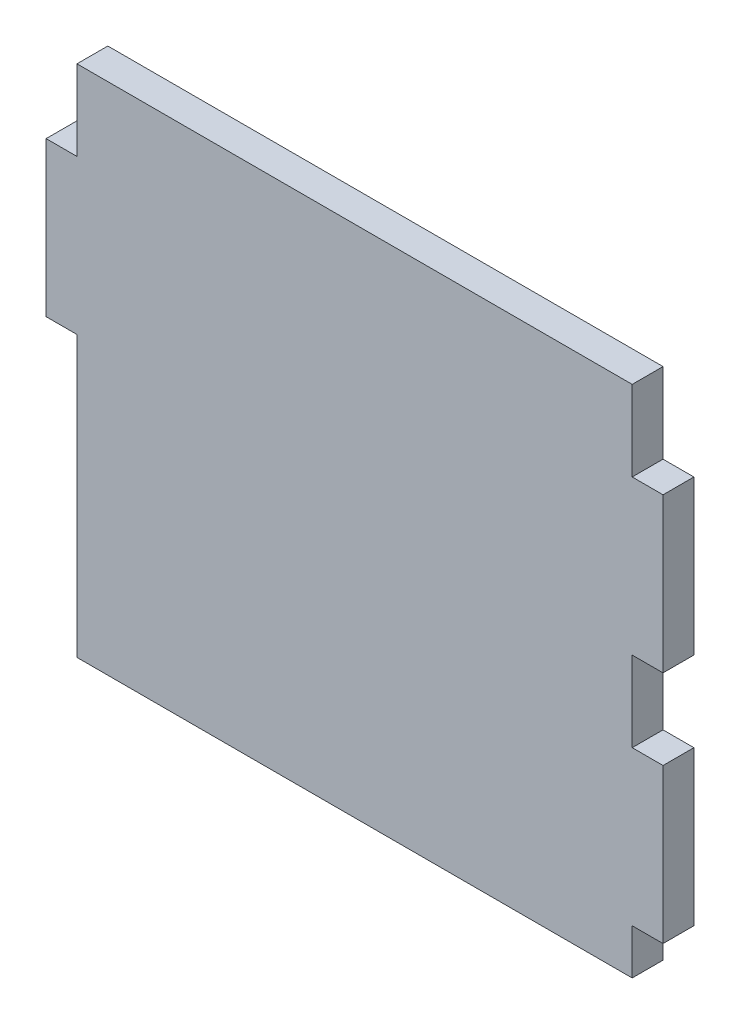
ISO-10303-21;
HEADER;
FILE_DESCRIPTION(('STEP AP214'),'2;1');
FILE_NAME('part.step','',(''),(''),'','','');
FILE_SCHEMA(('AUTOMOTIVE_DESIGN { 1 0 10303 214 1 1 1 1 }'));
ENDSEC;
DATA;
#1=APPLICATION_CONTEXT('core data for automotive mechanical design processes');
#2=APPLICATION_PROTOCOL_DEFINITION('international standard','automotive_design',2000,#1);
#3=PRODUCT_CONTEXT('',#1,'mechanical');
#4=PRODUCT('Part','Part','',(#3));
#5=PRODUCT_RELATED_PRODUCT_CATEGORY('part','',(#4));
#6=PRODUCT_DEFINITION_FORMATION('','',#4);
#7=PRODUCT_DEFINITION_CONTEXT('part definition',#1,'design');
#8=PRODUCT_DEFINITION('design','',#6,#7);
#9=PRODUCT_DEFINITION_SHAPE('','',#8);
#10=(LENGTH_UNIT() NAMED_UNIT(*) SI_UNIT(.MILLI.,.METRE.));
#11=(NAMED_UNIT(*) PLANE_ANGLE_UNIT() SI_UNIT($,.RADIAN.));
#12=(NAMED_UNIT(*) SI_UNIT($,.STERADIAN.) SOLID_ANGLE_UNIT());
#13=UNCERTAINTY_MEASURE_WITH_UNIT(LENGTH_MEASURE(1.E-05),#10,'distance_accuracy_value','');
#14=(GEOMETRIC_REPRESENTATION_CONTEXT(3) GLOBAL_UNCERTAINTY_ASSIGNED_CONTEXT((#13)) GLOBAL_UNIT_ASSIGNED_CONTEXT((#10,
#11,#12)) REPRESENTATION_CONTEXT('',''));
#15=CARTESIAN_POINT('',(0.,0.,0.));
#16=DIRECTION('',(0.,0.,1.));
#17=DIRECTION('',(1.,0.,0.));
#18=AXIS2_PLACEMENT_3D('',#15,#16,#17);
#19=CARTESIAN_POINT('',(19.0065393518518,16.5420138888889,3.));
#20=DIRECTION('',(-1.,0.,0.));
#21=DIRECTION('',(0.,-1.,0.));
#22=AXIS2_PLACEMENT_3D('',#19,#20,#21);
#23=PLANE('',#22);
#24=DIRECTION('',(0.,1.,0.));
#25=VECTOR('',#24,1.);
#26=CARTESIAN_POINT('',(19.0065393518518,16.5420138888889,3.));
#27=LINE('',#26,#25);
#28=CARTESIAN_POINT('',(19.0065393518519,-6.25798611111111,3.));
#29=VERTEX_POINT('',#28);
#30=CARTESIAN_POINT('',(19.0065393518519,8.74201388888889,3.));
#31=VERTEX_POINT('',#30);
#32=EDGE_CURVE('E172',#29,#31,#27,.T.);
#33=ORIENTED_EDGE('',*,*,#32,.F.);
#34=DIRECTION('',(0.,0.,1.));
#35=VECTOR('',#34,1.);
#36=CARTESIAN_POINT('',(19.0065393518519,-6.25798611111111,0.));
#37=LINE('',#36,#35);
#38=CARTESIAN_POINT('',(19.0065393518519,-6.25798611111111,0.));
#39=VERTEX_POINT('',#38);
#40=EDGE_CURVE('E285',#39,#29,#37,.T.);
#41=ORIENTED_EDGE('',*,*,#40,.F.);
#42=DIRECTION('',(0.,1.,0.));
#43=VECTOR('',#42,1.);
#44=CARTESIAN_POINT('',(19.0065393518518,16.5420138888889,0.));
#45=LINE('',#44,#43);
#46=CARTESIAN_POINT('',(19.0065393518518,8.74201388888889,0.));
#47=VERTEX_POINT('',#46);
#48=EDGE_CURVE('E184',#39,#47,#45,.T.);
#49=ORIENTED_EDGE('',*,*,#48,.T.);
#50=DIRECTION('',(0.,0.,1.));
#51=VECTOR('',#50,1.);
#52=CARTESIAN_POINT('',(19.0065393518519,8.74201388888889,0.));
#53=LINE('',#52,#51);
#54=EDGE_CURVE('E250',#47,#31,#53,.T.);
#55=ORIENTED_EDGE('',*,*,#54,.T.);
#56=EDGE_LOOP('',(#33,#41,#49,#55));
#57=FACE_BOUND('',#56,.T.);
#58=ADVANCED_FACE('F32',(#57),#23,.F.);
#59=CARTESIAN_POINT('',(-40.9934606481482,16.5420138888889,3.));
#60=DIRECTION('',(1.,0.,0.));
#61=DIRECTION('',(0.,0.,-1.));
#62=AXIS2_PLACEMENT_3D('',#59,#60,#61);
#63=PLANE('',#62);
#64=DIRECTION('',(0.,-1.,0.));
#65=VECTOR('',#64,1.);
#66=CARTESIAN_POINT('',(-40.9934606481482,16.5420138888889,0.));
#67=LINE('',#66,#65);
#68=CARTESIAN_POINT('',(-40.9934606481482,8.74201388888889,0.));
#69=VERTEX_POINT('',#68);
#70=CARTESIAN_POINT('',(-40.9934606481482,-6.25798611111111,0.));
#71=VERTEX_POINT('',#70);
#72=EDGE_CURVE('E179',#69,#71,#67,.T.);
#73=ORIENTED_EDGE('',*,*,#72,.T.);
#74=DIRECTION('',(0.,0.,1.));
#75=VECTOR('',#74,1.);
#76=CARTESIAN_POINT('',(-40.9934606481482,-6.25798611111111,0.));
#77=LINE('',#76,#75);
#78=CARTESIAN_POINT('',(-40.9934606481482,-6.25798611111111,3.));
#79=VERTEX_POINT('',#78);
#80=EDGE_CURVE('E226',#71,#79,#77,.T.);
#81=ORIENTED_EDGE('',*,*,#80,.T.);
#82=DIRECTION('',(0.,-1.,0.));
#83=VECTOR('',#82,1.);
#84=CARTESIAN_POINT('',(-40.9934606481482,16.5420138888889,3.));
#85=LINE('',#84,#83);
#86=CARTESIAN_POINT('',(-40.9934606481482,8.74201388888889,3.));
#87=VERTEX_POINT('',#86);
#88=EDGE_CURVE('E173',#87,#79,#85,.T.);
#89=ORIENTED_EDGE('',*,*,#88,.F.);
#90=DIRECTION('',(0.,0.,1.));
#91=VECTOR('',#90,1.);
#92=CARTESIAN_POINT('',(-40.9934606481482,8.74201388888889,0.));
#93=LINE('',#92,#91);
#94=EDGE_CURVE('E218',#69,#87,#93,.T.);
#95=ORIENTED_EDGE('',*,*,#94,.F.);
#96=EDGE_LOOP('',(#73,#81,#89,#95));
#97=FACE_BOUND('',#96,.T.);
#98=ADVANCED_FACE('F34',(#97),#63,.F.);
#99=CARTESIAN_POINT('',(-40.9934606481482,-33.4579861111111,3.));
#100=DIRECTION('',(0.,1.,0.));
#101=DIRECTION('',(0.,0.,1.));
#102=AXIS2_PLACEMENT_3D('',#99,#100,#101);
#103=PLANE('',#102);
#104=DIRECTION('',(1.,0.,0.));
#105=VECTOR('',#104,1.);
#106=CARTESIAN_POINT('',(-40.9934606481482,-33.4579861111111,3.));
#107=LINE('',#106,#105);
#108=CARTESIAN_POINT('',(-37.9934606481481,-33.4579861111111,3.));
#109=VERTEX_POINT('',#108);
#110=CARTESIAN_POINT('',(16.0065393518519,-33.4579861111111,3.));
#111=VERTEX_POINT('',#110);
#112=EDGE_CURVE('E153',#109,#111,#107,.T.);
#113=ORIENTED_EDGE('',*,*,#112,.F.);
#114=DIRECTION('',(0.,0.,1.));
#115=VECTOR('',#114,1.);
#116=CARTESIAN_POINT('',(-37.9934606481481,-33.4579861111111,-7.));
#117=LINE('',#116,#115);
#118=CARTESIAN_POINT('',(-37.9934606481481,-33.4579861111111,0.));
#119=VERTEX_POINT('',#118);
#120=EDGE_CURVE('E161',#119,#109,#117,.T.);
#121=ORIENTED_EDGE('',*,*,#120,.F.);
#122=DIRECTION('',(1.,0.,0.));
#123=VECTOR('',#122,1.);
#124=CARTESIAN_POINT('',(-40.9934606481482,-33.4579861111111,0.));
#125=LINE('',#124,#123);
#126=CARTESIAN_POINT('',(16.0065393518519,-33.4579861111111,0.));
#127=VERTEX_POINT('',#126);
#128=EDGE_CURVE('E182',#119,#127,#125,.T.);
#129=ORIENTED_EDGE('',*,*,#128,.T.);
#130=DIRECTION('',(0.,0.,1.));
#131=VECTOR('',#130,1.);
#132=CARTESIAN_POINT('',(16.0065393518519,-33.4579861111111,3.));
#133=LINE('',#132,#131);
#134=EDGE_CURVE('E171',#127,#111,#133,.T.);
#135=ORIENTED_EDGE('',*,*,#134,.T.);
#136=EDGE_LOOP('',(#113,#121,#129,#135));
#137=FACE_BOUND('',#136,.T.);
#138=ADVANCED_FACE('F170',(#137),#103,.F.);
#139=CARTESIAN_POINT('',(19.0065393518519,-29.0579861111111,0.));
#140=VERTEX_POINT('',#139);
#141=CARTESIAN_POINT('',(19.0065393518519,-14.0579861111111,0.));
#142=VERTEX_POINT('',#141);
#143=EDGE_CURVE('E185',#140,#142,#45,.T.);
#144=ORIENTED_EDGE('',*,*,#143,.T.);
#145=DIRECTION('',(0.,0.,1.));
#146=VECTOR('',#145,1.);
#147=CARTESIAN_POINT('',(19.0065393518519,-14.0579861111111,0.));
#148=LINE('',#147,#146);
#149=CARTESIAN_POINT('',(19.0065393518519,-14.0579861111111,3.));
#150=VERTEX_POINT('',#149);
#151=EDGE_CURVE('E57',#142,#150,#148,.T.);
#152=ORIENTED_EDGE('',*,*,#151,.T.);
#153=CARTESIAN_POINT('',(19.0065393518519,-29.0579861111111,3.));
#154=VERTEX_POINT('',#153);
#155=EDGE_CURVE('E41',#154,#150,#27,.T.);
#156=ORIENTED_EDGE('',*,*,#155,.F.);
#157=DIRECTION('',(0.,0.,1.));
#158=VECTOR('',#157,1.);
#159=CARTESIAN_POINT('',(19.0065393518519,-29.0579861111111,0.));
#160=LINE('',#159,#158);
#161=EDGE_CURVE('E278',#140,#154,#160,.T.);
#162=ORIENTED_EDGE('',*,*,#161,.F.);
#163=EDGE_LOOP('',(#144,#152,#156,#162));
#164=FACE_BOUND('',#163,.T.);
#165=ADVANCED_FACE('F310',(#164),#23,.F.);
#166=CARTESIAN_POINT('',(-40.9934606481482,16.5420138888889,3.));
#167=DIRECTION('',(0.,-1.,0.));
#168=DIRECTION('',(0.,0.,-1.));
#169=AXIS2_PLACEMENT_3D('',#166,#167,#168);
#170=PLANE('',#169);
#171=DIRECTION('',(-1.,0.,0.));
#172=VECTOR('',#171,1.);
#173=CARTESIAN_POINT('',(-40.9934606481482,16.5420138888889,3.));
#174=LINE('',#173,#172);
#175=CARTESIAN_POINT('',(16.0065393518519,16.5420138888889,3.));
#176=VERTEX_POINT('',#175);
#177=CARTESIAN_POINT('',(-37.9934606481481,16.5420138888889,3.));
#178=VERTEX_POINT('',#177);
#179=EDGE_CURVE('E11',#176,#178,#174,.T.);
#180=ORIENTED_EDGE('',*,*,#179,.F.);
#181=DIRECTION('',(0.,0.,1.));
#182=VECTOR('',#181,1.);
#183=CARTESIAN_POINT('',(16.0065393518519,16.5420138888889,0.));
#184=LINE('',#183,#182);
#185=CARTESIAN_POINT('',(16.0065393518519,16.5420138888889,0.));
#186=VERTEX_POINT('',#185);
#187=EDGE_CURVE('E158',#186,#176,#184,.T.);
#188=ORIENTED_EDGE('',*,*,#187,.F.);
#189=DIRECTION('',(-1.,0.,0.));
#190=VECTOR('',#189,1.);
#191=CARTESIAN_POINT('',(-40.9934606481482,16.5420138888889,0.));
#192=LINE('',#191,#190);
#193=CARTESIAN_POINT('',(-37.9934606481481,16.5420138888889,0.));
#194=VERTEX_POINT('',#193);
#195=EDGE_CURVE('E36',#186,#194,#192,.T.);
#196=ORIENTED_EDGE('',*,*,#195,.T.);
#197=DIRECTION('',(0.,0.,1.));
#198=VECTOR('',#197,1.);
#199=CARTESIAN_POINT('',(-37.9934606481481,16.5420138888889,0.));
#200=LINE('',#199,#198);
#201=EDGE_CURVE('E183',#194,#178,#200,.T.);
#202=ORIENTED_EDGE('',*,*,#201,.T.);
#203=EDGE_LOOP('',(#180,#188,#196,#202));
#204=FACE_BOUND('',#203,.T.);
#205=ADVANCED_FACE('F201',(#204),#170,.F.);
#206=CARTESIAN_POINT('',(0.,0.,3.));
#207=DIRECTION('',(0.,0.,1.));
#208=DIRECTION('',(1.,0.,0.));
#209=AXIS2_PLACEMENT_3D('',#206,#207,#208);
#210=PLANE('',#209);
#211=DIRECTION('',(0.,1.,0.));
#212=VECTOR('',#211,1.);
#213=CARTESIAN_POINT('',(-37.9934606481481,-6.25798611111111,3.));
#214=LINE('',#213,#212);
#215=CARTESIAN_POINT('',(-37.9934606481481,-6.25798611111111,3.));
#216=VERTEX_POINT('',#215);
#217=EDGE_CURVE('E148',#109,#216,#214,.T.);
#218=ORIENTED_EDGE('',*,*,#217,.F.);
#219=ORIENTED_EDGE('',*,*,#112,.T.);
#220=DIRECTION('',(0.,-1.,0.));
#221=VECTOR('',#220,1.);
#222=CARTESIAN_POINT('',(16.0065393518519,-29.0579861111111,3.));
#223=LINE('',#222,#221);
#224=CARTESIAN_POINT('',(16.0065393518519,-29.0579861111111,3.));
#225=VERTEX_POINT('',#224);
#226=EDGE_CURVE('E167',#225,#111,#223,.T.);
#227=ORIENTED_EDGE('',*,*,#226,.F.);
#228=DIRECTION('',(-1.,0.,0.));
#229=VECTOR('',#228,1.);
#230=CARTESIAN_POINT('',(16.0065393518519,-29.0579861111111,3.));
#231=LINE('',#230,#229);
#232=EDGE_CURVE('E269',#154,#225,#231,.T.);
#233=ORIENTED_EDGE('',*,*,#232,.F.);
#234=ORIENTED_EDGE('',*,*,#155,.T.);
#235=DIRECTION('',(1.,0.,0.));
#236=VECTOR('',#235,1.);
#237=CARTESIAN_POINT('',(16.0065393518519,-14.0579861111111,3.));
#238=LINE('',#237,#236);
#239=CARTESIAN_POINT('',(16.0065393518519,-14.0579861111111,3.));
#240=VERTEX_POINT('',#239);
#241=EDGE_CURVE('E294',#240,#150,#238,.T.);
#242=ORIENTED_EDGE('',*,*,#241,.F.);
#243=DIRECTION('',(0.,-1.,0.));
#244=VECTOR('',#243,1.);
#245=CARTESIAN_POINT('',(16.0065393518519,-6.25798611111111,3.));
#246=LINE('',#245,#244);
#247=CARTESIAN_POINT('',(16.0065393518519,-6.25798611111111,3.));
#248=VERTEX_POINT('',#247);
#249=EDGE_CURVE('E277',#248,#240,#246,.T.);
#250=ORIENTED_EDGE('',*,*,#249,.F.);
#251=DIRECTION('',(-1.,0.,0.));
#252=VECTOR('',#251,1.);
#253=CARTESIAN_POINT('',(16.0065393518519,-6.25798611111111,3.));
#254=LINE('',#253,#252);
#255=EDGE_CURVE('E289',#29,#248,#254,.T.);
#256=ORIENTED_EDGE('',*,*,#255,.F.);
#257=ORIENTED_EDGE('',*,*,#32,.T.);
#258=DIRECTION('',(1.,0.,0.));
#259=VECTOR('',#258,1.);
#260=CARTESIAN_POINT('',(16.0065393518519,8.74201388888889,3.));
#261=LINE('',#260,#259);
#262=CARTESIAN_POINT('',(16.0065393518519,8.74201388888889,3.));
#263=VERTEX_POINT('',#262);
#264=EDGE_CURVE('E238',#263,#31,#261,.T.);
#265=ORIENTED_EDGE('',*,*,#264,.F.);
#266=DIRECTION('',(0.,-1.,0.));
#267=VECTOR('',#266,1.);
#268=CARTESIAN_POINT('',(16.0065393518519,16.5420138888889,3.));
#269=LINE('',#268,#267);
#270=EDGE_CURVE('E236',#176,#263,#269,.T.);
#271=ORIENTED_EDGE('',*,*,#270,.F.);
#272=ORIENTED_EDGE('',*,*,#179,.T.);
#273=DIRECTION('',(0.,1.,0.));
#274=VECTOR('',#273,1.);
#275=CARTESIAN_POINT('',(-37.9934606481481,16.5420138888889,3.));
#276=LINE('',#275,#274);
#277=CARTESIAN_POINT('',(-37.9934606481481,8.74201388888889,3.));
#278=VERTEX_POINT('',#277);
#279=EDGE_CURVE('E211',#278,#178,#276,.T.);
#280=ORIENTED_EDGE('',*,*,#279,.F.);
#281=DIRECTION('',(1.,0.,0.));
#282=VECTOR('',#281,1.);
#283=CARTESIAN_POINT('',(-40.9934606481482,8.74201388888889,3.));
#284=LINE('',#283,#282);
#285=EDGE_CURVE('E223',#87,#278,#284,.T.);
#286=ORIENTED_EDGE('',*,*,#285,.F.);
#287=ORIENTED_EDGE('',*,*,#88,.T.);
#288=DIRECTION('',(-1.,0.,0.));
#289=VECTOR('',#288,1.);
#290=CARTESIAN_POINT('',(-40.9934606481482,-6.25798611111111,3.));
#291=LINE('',#290,#289);
#292=EDGE_CURVE('E156',#216,#79,#291,.T.);
#293=ORIENTED_EDGE('',*,*,#292,.F.);
#294=EDGE_LOOP('',(#218,#219,#227,#233,#234,#242,#250,#256,#257,#265,#271,#272,#280,#286,#287,#293));
#295=FACE_BOUND('',#294,.T.);
#296=ADVANCED_FACE('F150',(#295),#210,.T.);
#297=CARTESIAN_POINT('',(0.,0.,0.));
#298=DIRECTION('',(0.,0.,1.));
#299=DIRECTION('',(1.,0.,0.));
#300=AXIS2_PLACEMENT_3D('',#297,#298,#299);
#301=PLANE('',#300);
#302=ORIENTED_EDGE('',*,*,#128,.F.);
#303=DIRECTION('',(0.,1.,0.));
#304=VECTOR('',#303,1.);
#305=CARTESIAN_POINT('',(-37.9934606481481,-6.25798611111111,0.));
#306=LINE('',#305,#304);
#307=CARTESIAN_POINT('',(-37.9934606481481,-6.25798611111111,0.));
#308=VERTEX_POINT('',#307);
#309=EDGE_CURVE('E164',#119,#308,#306,.T.);
#310=ORIENTED_EDGE('',*,*,#309,.T.);
#311=DIRECTION('',(-1.,0.,0.));
#312=VECTOR('',#311,1.);
#313=CARTESIAN_POINT('',(-40.9934606481482,-6.25798611111111,0.));
#314=LINE('',#313,#312);
#315=EDGE_CURVE('E255',#308,#71,#314,.T.);
#316=ORIENTED_EDGE('',*,*,#315,.T.);
#317=ORIENTED_EDGE('',*,*,#72,.F.);
#318=DIRECTION('',(1.,0.,0.));
#319=VECTOR('',#318,1.);
#320=CARTESIAN_POINT('',(-40.9934606481482,8.74201388888889,0.));
#321=LINE('',#320,#319);
#322=CARTESIAN_POINT('',(-37.9934606481481,8.74201388888889,0.));
#323=VERTEX_POINT('',#322);
#324=EDGE_CURVE('E217',#69,#323,#321,.T.);
#325=ORIENTED_EDGE('',*,*,#324,.T.);
#326=DIRECTION('',(0.,1.,0.));
#327=VECTOR('',#326,1.);
#328=CARTESIAN_POINT('',(-37.9934606481481,16.5420138888889,0.));
#329=LINE('',#328,#327);
#330=EDGE_CURVE('E208',#323,#194,#329,.T.);
#331=ORIENTED_EDGE('',*,*,#330,.T.);
#332=ORIENTED_EDGE('',*,*,#195,.F.);
#333=DIRECTION('',(0.,-1.,0.));
#334=VECTOR('',#333,1.);
#335=CARTESIAN_POINT('',(16.0065393518519,16.5420138888889,0.));
#336=LINE('',#335,#334);
#337=CARTESIAN_POINT('',(16.0065393518519,8.74201388888889,0.));
#338=VERTEX_POINT('',#337);
#339=EDGE_CURVE('E241',#186,#338,#336,.T.);
#340=ORIENTED_EDGE('',*,*,#339,.T.);
#341=DIRECTION('',(1.,0.,0.));
#342=VECTOR('',#341,1.);
#343=CARTESIAN_POINT('',(16.0065393518519,8.74201388888889,0.));
#344=LINE('',#343,#342);
#345=EDGE_CURVE('E246',#338,#47,#344,.T.);
#346=ORIENTED_EDGE('',*,*,#345,.T.);
#347=ORIENTED_EDGE('',*,*,#48,.F.);
#348=DIRECTION('',(-1.,0.,0.));
#349=VECTOR('',#348,1.);
#350=CARTESIAN_POINT('',(16.0065393518519,-6.25798611111111,0.));
#351=LINE('',#350,#349);
#352=CARTESIAN_POINT('',(16.0065393518519,-6.25798611111111,0.));
#353=VERTEX_POINT('',#352);
#354=EDGE_CURVE('E306',#39,#353,#351,.T.);
#355=ORIENTED_EDGE('',*,*,#354,.T.);
#356=DIRECTION('',(0.,-1.,0.));
#357=VECTOR('',#356,1.);
#358=CARTESIAN_POINT('',(16.0065393518519,-6.25798611111111,0.));
#359=LINE('',#358,#357);
#360=CARTESIAN_POINT('',(16.0065393518519,-14.0579861111111,0.));
#361=VERTEX_POINT('',#360);
#362=EDGE_CURVE('E293',#353,#361,#359,.T.);
#363=ORIENTED_EDGE('',*,*,#362,.T.);
#364=DIRECTION('',(1.,0.,0.));
#365=VECTOR('',#364,1.);
#366=CARTESIAN_POINT('',(16.0065393518519,-14.0579861111111,0.));
#367=LINE('',#366,#365);
#368=EDGE_CURVE('E297',#361,#142,#367,.T.);
#369=ORIENTED_EDGE('',*,*,#368,.T.);
#370=ORIENTED_EDGE('',*,*,#143,.F.);
#371=DIRECTION('',(-1.,0.,0.));
#372=VECTOR('',#371,1.);
#373=CARTESIAN_POINT('',(16.0065393518519,-29.0579861111111,0.));
#374=LINE('',#373,#372);
#375=CARTESIAN_POINT('',(16.0065393518519,-29.0579861111111,0.));
#376=VERTEX_POINT('',#375);
#377=EDGE_CURVE('E273',#140,#376,#374,.T.);
#378=ORIENTED_EDGE('',*,*,#377,.T.);
#379=DIRECTION('',(0.,-1.,0.));
#380=VECTOR('',#379,1.);
#381=CARTESIAN_POINT('',(16.0065393518519,-29.0579861111111,0.));
#382=LINE('',#381,#380);
#383=EDGE_CURVE('E49',#376,#127,#382,.T.);
#384=ORIENTED_EDGE('',*,*,#383,.T.);
#385=EDGE_LOOP('',(#302,#310,#316,#317,#325,#331,#332,#340,#346,#347,#355,#363,#369,#370,#378,#384));
#386=FACE_BOUND('',#385,.T.);
#387=ADVANCED_FACE('F215',(#386),#301,.F.);
#388=CARTESIAN_POINT('',(-37.9934606481481,16.5420138888889,0.));
#389=DIRECTION('',(1.,0.,0.));
#390=DIRECTION('',(0.,0.,-1.));
#391=AXIS2_PLACEMENT_3D('',#388,#389,#390);
#392=PLANE('',#391);
#393=ORIENTED_EDGE('',*,*,#279,.T.);
#394=ORIENTED_EDGE('',*,*,#201,.F.);
#395=ORIENTED_EDGE('',*,*,#330,.F.);
#396=DIRECTION('',(0.,0.,1.));
#397=VECTOR('',#396,1.);
#398=CARTESIAN_POINT('',(-37.9934606481481,8.74201388888889,0.));
#399=LINE('',#398,#397);
#400=EDGE_CURVE('E212',#323,#278,#399,.T.);
#401=ORIENTED_EDGE('',*,*,#400,.T.);
#402=EDGE_LOOP('',(#393,#394,#395,#401));
#403=FACE_BOUND('',#402,.T.);
#404=ADVANCED_FACE('F207',(#403),#392,.F.);
#405=CARTESIAN_POINT('',(-40.9934606481482,8.74201388888889,0.));
#406=DIRECTION('',(0.,-1.,0.));
#407=DIRECTION('',(0.,0.,-1.));
#408=AXIS2_PLACEMENT_3D('',#405,#406,#407);
#409=PLANE('',#408);
#410=ORIENTED_EDGE('',*,*,#285,.T.);
#411=ORIENTED_EDGE('',*,*,#400,.F.);
#412=ORIENTED_EDGE('',*,*,#324,.F.);
#413=ORIENTED_EDGE('',*,*,#94,.T.);
#414=EDGE_LOOP('',(#410,#411,#412,#413));
#415=FACE_BOUND('',#414,.T.);
#416=ADVANCED_FACE('F230',(#415),#409,.F.);
#417=CARTESIAN_POINT('',(-40.9934606481482,-6.25798611111111,0.));
#418=DIRECTION('',(0.,1.,0.));
#419=DIRECTION('',(0.,0.,1.));
#420=AXIS2_PLACEMENT_3D('',#417,#418,#419);
#421=PLANE('',#420);
#422=ORIENTED_EDGE('',*,*,#292,.T.);
#423=ORIENTED_EDGE('',*,*,#80,.F.);
#424=ORIENTED_EDGE('',*,*,#315,.F.);
#425=DIRECTION('',(0.,0.,1.));
#426=VECTOR('',#425,1.);
#427=CARTESIAN_POINT('',(-37.9934606481481,-6.25798611111111,0.));
#428=LINE('',#427,#426);
#429=EDGE_CURVE('E257',#308,#216,#428,.T.);
#430=ORIENTED_EDGE('',*,*,#429,.T.);
#431=EDGE_LOOP('',(#422,#423,#424,#430));
#432=FACE_BOUND('',#431,.T.);
#433=ADVANCED_FACE('F263',(#432),#421,.F.);
#434=CARTESIAN_POINT('',(-37.9934606481481,-6.25798611111111,0.));
#435=DIRECTION('',(1.,0.,0.));
#436=DIRECTION('',(0.,0.,-1.));
#437=AXIS2_PLACEMENT_3D('',#434,#435,#436);
#438=PLANE('',#437);
#439=ORIENTED_EDGE('',*,*,#217,.T.);
#440=ORIENTED_EDGE('',*,*,#429,.F.);
#441=ORIENTED_EDGE('',*,*,#309,.F.);
#442=ORIENTED_EDGE('',*,*,#120,.T.);
#443=EDGE_LOOP('',(#439,#440,#441,#442));
#444=FACE_BOUND('',#443,.T.);
#445=ADVANCED_FACE('F162',(#444),#438,.F.);
#446=CARTESIAN_POINT('',(16.0065393518519,16.5420138888889,0.));
#447=DIRECTION('',(-1.,0.,0.));
#448=DIRECTION('',(0.,0.,1.));
#449=AXIS2_PLACEMENT_3D('',#446,#447,#448);
#450=PLANE('',#449);
#451=ORIENTED_EDGE('',*,*,#270,.T.);
#452=DIRECTION('',(0.,0.,1.));
#453=VECTOR('',#452,1.);
#454=CARTESIAN_POINT('',(16.0065393518519,8.74201388888889,0.));
#455=LINE('',#454,#453);
#456=EDGE_CURVE('E252',#338,#263,#455,.T.);
#457=ORIENTED_EDGE('',*,*,#456,.F.);
#458=ORIENTED_EDGE('',*,*,#339,.F.);
#459=ORIENTED_EDGE('',*,*,#187,.T.);
#460=EDGE_LOOP('',(#451,#457,#458,#459));
#461=FACE_BOUND('',#460,.T.);
#462=ADVANCED_FACE('F376',(#461),#450,.F.);
#463=CARTESIAN_POINT('',(16.0065393518519,8.74201388888889,0.));
#464=DIRECTION('',(0.,-1.,0.));
#465=DIRECTION('',(0.,0.,-1.));
#466=AXIS2_PLACEMENT_3D('',#463,#464,#465);
#467=PLANE('',#466);
#468=ORIENTED_EDGE('',*,*,#264,.T.);
#469=ORIENTED_EDGE('',*,*,#54,.F.);
#470=ORIENTED_EDGE('',*,*,#345,.F.);
#471=ORIENTED_EDGE('',*,*,#456,.T.);
#472=EDGE_LOOP('',(#468,#469,#470,#471));
#473=FACE_BOUND('',#472,.T.);
#474=ADVANCED_FACE('F283',(#473),#467,.F.);
#475=CARTESIAN_POINT('',(16.0065393518519,-29.0579861111111,0.));
#476=DIRECTION('',(-1.,0.,0.));
#477=DIRECTION('',(0.,0.,1.));
#478=AXIS2_PLACEMENT_3D('',#475,#476,#477);
#479=PLANE('',#478);
#480=ORIENTED_EDGE('',*,*,#383,.F.);
#481=DIRECTION('',(0.,0.,1.));
#482=VECTOR('',#481,1.);
#483=CARTESIAN_POINT('',(16.0065393518519,-29.0579861111111,0.));
#484=LINE('',#483,#482);
#485=EDGE_CURVE('E266',#376,#225,#484,.T.);
#486=ORIENTED_EDGE('',*,*,#485,.T.);
#487=ORIENTED_EDGE('',*,*,#226,.T.);
#488=ORIENTED_EDGE('',*,*,#134,.F.);
#489=EDGE_LOOP('',(#480,#486,#487,#488));
#490=FACE_BOUND('',#489,.T.);
#491=ADVANCED_FACE('F265',(#490),#479,.F.);
#492=CARTESIAN_POINT('',(16.0065393518519,-29.0579861111111,0.));
#493=DIRECTION('',(0.,1.,0.));
#494=DIRECTION('',(0.,0.,1.));
#495=AXIS2_PLACEMENT_3D('',#492,#493,#494);
#496=PLANE('',#495);
#497=ORIENTED_EDGE('',*,*,#232,.T.);
#498=ORIENTED_EDGE('',*,*,#485,.F.);
#499=ORIENTED_EDGE('',*,*,#377,.F.);
#500=ORIENTED_EDGE('',*,*,#161,.T.);
#501=EDGE_LOOP('',(#497,#498,#499,#500));
#502=FACE_BOUND('',#501,.T.);
#503=ADVANCED_FACE('F308',(#502),#496,.F.);
#504=CARTESIAN_POINT('',(16.0065393518519,-6.25798611111111,0.));
#505=DIRECTION('',(-1.,0.,0.));
#506=DIRECTION('',(0.,0.,1.));
#507=AXIS2_PLACEMENT_3D('',#504,#505,#506);
#508=PLANE('',#507);
#509=ORIENTED_EDGE('',*,*,#249,.T.);
#510=DIRECTION('',(0.,0.,1.));
#511=VECTOR('',#510,1.);
#512=CARTESIAN_POINT('',(16.0065393518519,-14.0579861111111,0.));
#513=LINE('',#512,#511);
#514=EDGE_CURVE('E305',#361,#240,#513,.T.);
#515=ORIENTED_EDGE('',*,*,#514,.F.);
#516=ORIENTED_EDGE('',*,*,#362,.F.);
#517=DIRECTION('',(0.,0.,1.));
#518=VECTOR('',#517,1.);
#519=CARTESIAN_POINT('',(16.0065393518519,-6.25798611111111,0.));
#520=LINE('',#519,#518);
#521=EDGE_CURVE('E243',#353,#248,#520,.T.);
#522=ORIENTED_EDGE('',*,*,#521,.T.);
#523=EDGE_LOOP('',(#509,#515,#516,#522));
#524=FACE_BOUND('',#523,.T.);
#525=ADVANCED_FACE('F315',(#524),#508,.F.);
#526=CARTESIAN_POINT('',(16.0065393518519,-6.25798611111111,0.));
#527=DIRECTION('',(0.,1.,0.));
#528=DIRECTION('',(0.,0.,1.));
#529=AXIS2_PLACEMENT_3D('',#526,#527,#528);
#530=PLANE('',#529);
#531=ORIENTED_EDGE('',*,*,#255,.T.);
#532=ORIENTED_EDGE('',*,*,#521,.F.);
#533=ORIENTED_EDGE('',*,*,#354,.F.);
#534=ORIENTED_EDGE('',*,*,#40,.T.);
#535=EDGE_LOOP('',(#531,#532,#533,#534));
#536=FACE_BOUND('',#535,.T.);
#537=ADVANCED_FACE('F318',(#536),#530,.F.);
#538=CARTESIAN_POINT('',(16.0065393518519,-14.0579861111111,0.));
#539=DIRECTION('',(0.,-1.,0.));
#540=DIRECTION('',(0.,0.,-1.));
#541=AXIS2_PLACEMENT_3D('',#538,#539,#540);
#542=PLANE('',#541);
#543=ORIENTED_EDGE('',*,*,#241,.T.);
#544=ORIENTED_EDGE('',*,*,#151,.F.);
#545=ORIENTED_EDGE('',*,*,#368,.F.);
#546=ORIENTED_EDGE('',*,*,#514,.T.);
#547=EDGE_LOOP('',(#543,#544,#545,#546));
#548=FACE_BOUND('',#547,.T.);
#549=ADVANCED_FACE('F312',(#548),#542,.F.);
#550=CLOSED_SHELL('',(#58,#98,#138,#165,#205,#296,#387,#404,#416,#433,#445,#462,#474,#491,#503,
#525,#537,#549));
#551=MANIFOLD_SOLID_BREP('B2',#550);
#552=ADVANCED_BREP_SHAPE_REPRESENTATION('',(#18,#551),#14);
#553=SHAPE_DEFINITION_REPRESENTATION(#9,#552);
ENDSEC;
END-ISO-10303-21;
